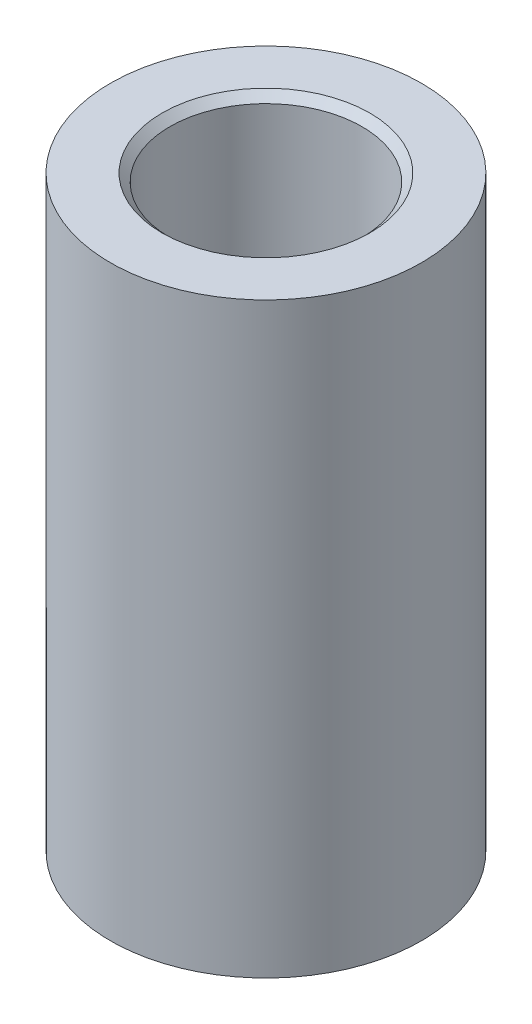
ISO-10303-21;
HEADER;
FILE_DESCRIPTION(('STEP AP214'),'2;1');
FILE_NAME('part.step','',(''),(''),'','','');
FILE_SCHEMA(('AUTOMOTIVE_DESIGN { 1 0 10303 214 1 1 1 1 }'));
ENDSEC;
DATA;
#1=APPLICATION_CONTEXT('core data for automotive mechanical design processes');
#2=APPLICATION_PROTOCOL_DEFINITION('international standard','automotive_design',2000,#1);
#3=PRODUCT_CONTEXT('',#1,'mechanical');
#4=PRODUCT('Part','Part','',(#3));
#5=PRODUCT_RELATED_PRODUCT_CATEGORY('part','',(#4));
#6=PRODUCT_DEFINITION_FORMATION('','',#4);
#7=PRODUCT_DEFINITION_CONTEXT('part definition',#1,'design');
#8=PRODUCT_DEFINITION('design','',#6,#7);
#9=PRODUCT_DEFINITION_SHAPE('','',#8);
#10=(LENGTH_UNIT() NAMED_UNIT(*) SI_UNIT(.MILLI.,.METRE.));
#11=(NAMED_UNIT(*) PLANE_ANGLE_UNIT() SI_UNIT($,.RADIAN.));
#12=(NAMED_UNIT(*) SI_UNIT($,.STERADIAN.) SOLID_ANGLE_UNIT());
#13=UNCERTAINTY_MEASURE_WITH_UNIT(LENGTH_MEASURE(1.E-05),#10,'distance_accuracy_value','');
#14=(GEOMETRIC_REPRESENTATION_CONTEXT(3) GLOBAL_UNCERTAINTY_ASSIGNED_CONTEXT((#13)) GLOBAL_UNIT_ASSIGNED_CONTEXT((#10,
#11,#12)) REPRESENTATION_CONTEXT('',''));
#15=CARTESIAN_POINT('',(0.,0.,0.));
#16=DIRECTION('',(0.,0.,1.));
#17=DIRECTION('',(1.,0.,0.));
#18=AXIS2_PLACEMENT_3D('',#15,#16,#17);
#19=CARTESIAN_POINT('',(0.,29.972,0.));
#20=DIRECTION('',(0.,-1.,0.));
#21=DIRECTION('',(0.,0.,-1.));
#22=AXIS2_PLACEMENT_3D('',#19,#20,#21);
#23=CYLINDRICAL_SURFACE('',#22,7.9375);
#24=CARTESIAN_POINT('',(0.,29.972,0.));
#25=DIRECTION('',(0.,1.,0.));
#26=DIRECTION('',(0.,0.,1.));
#27=AXIS2_PLACEMENT_3D('',#24,#25,#26);
#28=CIRCLE('',#27,7.9375);
#29=CARTESIAN_POINT('',(0.,29.972,-7.9375));
#30=VERTEX_POINT('',#29);
#31=EDGE_CURVE('E51',#30,#30,#28,.T.);
#32=CARTESIAN_POINT('',(0.,0.,0.));
#33=DIRECTION('',(0.,1.,0.));
#34=DIRECTION('',(0.,0.,1.));
#35=AXIS2_PLACEMENT_3D('',#32,#33,#34);
#36=CIRCLE('',#35,7.9375);
#37=CARTESIAN_POINT('',(0.,0.,-7.9375));
#38=VERTEX_POINT('',#37);
#39=EDGE_CURVE('E52',#38,#38,#36,.T.);
#40=CARTESIAN_POINT('',(0.,29.972,-7.9375));
#41=CARTESIAN_POINT('',(0.,29.6597916666667,-7.9375));
#42=CARTESIAN_POINT('',(0.,29.3475833333333,-7.9375));
#43=CARTESIAN_POINT('',(0.,28.7231666666667,-7.9375));
#44=CARTESIAN_POINT('',(0.,28.4109583333333,-7.9375));
#45=CARTESIAN_POINT('',(0.,27.7865416666667,-7.9375));
#46=CARTESIAN_POINT('',(0.,27.4743333333333,-7.9375));
#47=CARTESIAN_POINT('',(0.,26.8499166666667,-7.9375));
#48=CARTESIAN_POINT('',(0.,26.5377083333333,-7.9375));
#49=CARTESIAN_POINT('',(0.,25.9132916666667,-7.9375));
#50=CARTESIAN_POINT('',(0.,25.6010833333333,-7.9375));
#51=CARTESIAN_POINT('',(0.,24.9766666666667,-7.9375));
#52=CARTESIAN_POINT('',(0.,24.6644583333333,-7.9375));
#53=CARTESIAN_POINT('',(0.,24.0400416666667,-7.9375));
#54=CARTESIAN_POINT('',(0.,23.7278333333333,-7.9375));
#55=CARTESIAN_POINT('',(0.,23.1034166666667,-7.9375));
#56=CARTESIAN_POINT('',(0.,22.7912083333333,-7.9375));
#57=CARTESIAN_POINT('',(0.,22.1667916666667,-7.9375));
#58=CARTESIAN_POINT('',(0.,21.8545833333333,-7.9375));
#59=CARTESIAN_POINT('',(0.,21.2301666666667,-7.9375));
#60=CARTESIAN_POINT('',(0.,20.9179583333333,-7.9375));
#61=CARTESIAN_POINT('',(0.,20.2935416666667,-7.9375));
#62=CARTESIAN_POINT('',(0.,19.9813333333333,-7.9375));
#63=CARTESIAN_POINT('',(0.,19.3569166666667,-7.9375));
#64=CARTESIAN_POINT('',(0.,19.0447083333333,-7.9375));
#65=CARTESIAN_POINT('',(0.,18.4202916666667,-7.9375));
#66=CARTESIAN_POINT('',(0.,18.1080833333333,-7.9375));
#67=CARTESIAN_POINT('',(0.,17.4836666666667,-7.9375));
#68=CARTESIAN_POINT('',(0.,17.1714583333333,-7.9375));
#69=CARTESIAN_POINT('',(0.,16.5470416666667,-7.9375));
#70=CARTESIAN_POINT('',(0.,16.2348333333333,-7.9375));
#71=CARTESIAN_POINT('',(0.,15.6104166666667,-7.9375));
#72=CARTESIAN_POINT('',(0.,15.2982083333333,-7.9375));
#73=CARTESIAN_POINT('',(0.,14.6737916666667,-7.9375));
#74=CARTESIAN_POINT('',(0.,14.3615833333333,-7.9375));
#75=CARTESIAN_POINT('',(0.,13.7371666666667,-7.9375));
#76=CARTESIAN_POINT('',(0.,13.4249583333333,-7.9375));
#77=CARTESIAN_POINT('',(0.,12.8005416666667,-7.9375));
#78=CARTESIAN_POINT('',(0.,12.4883333333333,-7.9375));
#79=CARTESIAN_POINT('',(0.,11.8639166666667,-7.9375));
#80=CARTESIAN_POINT('',(0.,11.5517083333333,-7.9375));
#81=CARTESIAN_POINT('',(0.,10.9272916666667,-7.9375));
#82=CARTESIAN_POINT('',(0.,10.6150833333333,-7.9375));
#83=CARTESIAN_POINT('',(0.,9.99066666666667,-7.9375));
#84=CARTESIAN_POINT('',(0.,9.67845833333333,-7.9375));
#85=CARTESIAN_POINT('',(0.,9.05404166666667,-7.9375));
#86=CARTESIAN_POINT('',(0.,8.74183333333333,-7.9375));
#87=CARTESIAN_POINT('',(0.,8.11741666666667,-7.9375));
#88=CARTESIAN_POINT('',(0.,7.80520833333333,-7.9375));
#89=CARTESIAN_POINT('',(0.,7.18079166666667,-7.9375));
#90=CARTESIAN_POINT('',(0.,6.86858333333333,-7.9375));
#91=CARTESIAN_POINT('',(0.,6.24416666666667,-7.9375));
#92=CARTESIAN_POINT('',(0.,5.93195833333333,-7.9375));
#93=CARTESIAN_POINT('',(0.,5.30754166666667,-7.9375));
#94=CARTESIAN_POINT('',(0.,4.99533333333333,-7.9375));
#95=CARTESIAN_POINT('',(0.,4.37091666666667,-7.9375));
#96=CARTESIAN_POINT('',(0.,4.05870833333333,-7.9375));
#97=CARTESIAN_POINT('',(0.,3.43429166666667,-7.9375));
#98=CARTESIAN_POINT('',(0.,3.12208333333333,-7.9375));
#99=CARTESIAN_POINT('',(0.,2.49766666666667,-7.9375));
#100=CARTESIAN_POINT('',(0.,2.18545833333333,-7.9375));
#101=CARTESIAN_POINT('',(0.,1.56104166666667,-7.9375));
#102=CARTESIAN_POINT('',(0.,1.24883333333333,-7.9375));
#103=CARTESIAN_POINT('',(0.,0.624416666666667,-7.9375));
#104=CARTESIAN_POINT('',(0.,0.312208333333333,-7.9375));
#105=CARTESIAN_POINT('',(0.,0.,-7.9375));
#106=B_SPLINE_CURVE_WITH_KNOTS('',3,(#40,#41,#42,#43,#44,#45,#46,#47,#48,#49,#50,#51,#52,#53,
#54,#55,#56,#57,#58,#59,#60,#61,#62,#63,#64,#65,#66,#67,#68,#69,#70,#71,#72,#73,#74,#75,#76,#77,
#78,#79,#80,#81,#82,#83,#84,#85,#86,#87,#88,#89,#90,#91,#92,#93,#94,#95,#96,#97,#98,#99,#100,
#101,#102,#103,#104,#105),.UNSPECIFIED.,.F.,.F.,(4,2,2,2,2,2,2,2,2,2,2,2,2,2,2,2,2,2,2,2,2,2,2,
2,2,2,2,2,2,2,2,2,4),(0.,0.936624999999996,1.87325,2.809875,3.7465,4.683125,5.61975,6.556375,
7.493,8.429625,9.36625,10.302875,11.2395,12.176125,13.11275,14.049375,14.986,15.922625,16.85925,
17.795875,18.7325,19.669125,20.60575,21.542375,22.479,23.415625,24.35225,25.288875,26.2255,
27.162125,28.09875,29.035375,29.972),.UNSPECIFIED.);
#107=EDGE_CURVE('BSEAM31',#30,#38,#106,.T.);
#108=ORIENTED_EDGE('',*,*,#31,.F.);
#109=ORIENTED_EDGE('',*,*,#39,.T.);
#110=ORIENTED_EDGE('',*,*,#107,.T.);
#111=ORIENTED_EDGE('',*,*,#107,.F.);
#112=EDGE_LOOP('',(#108,#110,#109,#111));
#113=FACE_BOUND('',#112,.T.);
#114=ADVANCED_FACE('F31',(#113),#23,.T.);
#115=CARTESIAN_POINT('',(0.,29.972,0.));
#116=DIRECTION('',(0.,1.,0.));
#117=DIRECTION('',(0.,0.,1.));
#118=AXIS2_PLACEMENT_3D('',#115,#116,#117);
#119=PLANE('',#118);
#120=CARTESIAN_POINT('',(0.,29.972,0.));
#121=DIRECTION('',(0.,1.,0.));
#122=DIRECTION('',(0.,0.,1.));
#123=AXIS2_PLACEMENT_3D('',#120,#121,#122);
#124=CIRCLE('',#123,5.30219999999999);
#125=CARTESIAN_POINT('',(0.,29.972,5.30219999999999));
#126=VERTEX_POINT('',#125);
#127=EDGE_CURVE('E10',#126,#126,#124,.F.);
#128=ORIENTED_EDGE('',*,*,#127,.T.);
#129=EDGE_LOOP('',(#128));
#130=FACE_BOUND('',#129,.T.);
#131=ORIENTED_EDGE('',*,*,#31,.T.);
#132=EDGE_LOOP('',(#131));
#133=FACE_BOUND('',#132,.T.);
#134=ADVANCED_FACE('F58',(#130,#133),#119,.T.);
#135=CARTESIAN_POINT('',(0.,0.,0.));
#136=DIRECTION('',(0.,1.,0.));
#137=DIRECTION('',(0.,0.,1.));
#138=AXIS2_PLACEMENT_3D('',#135,#136,#137);
#139=PLANE('',#138);
#140=CARTESIAN_POINT('',(0.,0.,0.));
#141=DIRECTION('',(0.,1.,0.));
#142=DIRECTION('',(0.,0.,1.));
#143=AXIS2_PLACEMENT_3D('',#140,#141,#142);
#144=CIRCLE('',#143,5.30219999999999);
#145=CARTESIAN_POINT('',(0.,0.,5.30219999999999));
#146=VERTEX_POINT('',#145);
#147=EDGE_CURVE('E46',#146,#146,#144,.T.);
#148=ORIENTED_EDGE('',*,*,#147,.T.);
#149=EDGE_LOOP('',(#148));
#150=FACE_BOUND('',#149,.T.);
#151=ORIENTED_EDGE('',*,*,#39,.F.);
#152=EDGE_LOOP('',(#151));
#153=FACE_BOUND('',#152,.T.);
#154=ADVANCED_FACE('F65',(#150,#153),#139,.F.);
#155=CARTESIAN_POINT('',(0.,29.972,0.));
#156=DIRECTION('',(0.,1.,0.));
#157=DIRECTION('',(0.,0.,1.));
#158=AXIS2_PLACEMENT_3D('',#155,#156,#157);
#159=CYLINDRICAL_SURFACE('',#158,4.90219999999999);
#160=CARTESIAN_POINT('',(0.,0.400000000000001,0.));
#161=DIRECTION('',(0.,1.,0.));
#162=DIRECTION('',(0.,0.,1.));
#163=AXIS2_PLACEMENT_3D('',#160,#161,#162);
#164=CIRCLE('',#163,4.90219999999999);
#165=CARTESIAN_POINT('',(0.,0.400000000000001,4.90219999999999));
#166=VERTEX_POINT('',#165);
#167=EDGE_CURVE('E38',#166,#166,#164,.F.);
#168=ORIENTED_EDGE('',*,*,#167,.T.);
#169=EDGE_LOOP('',(#168));
#170=FACE_BOUND('',#169,.T.);
#171=CARTESIAN_POINT('',(0.,29.572,0.));
#172=DIRECTION('',(0.,1.,0.));
#173=DIRECTION('',(0.,0.,1.));
#174=AXIS2_PLACEMENT_3D('',#171,#172,#173);
#175=CIRCLE('',#174,4.90219999999999);
#176=CARTESIAN_POINT('',(0.,29.572,4.90219999999999));
#177=VERTEX_POINT('',#176);
#178=EDGE_CURVE('E42',#177,#177,#175,.T.);
#179=ORIENTED_EDGE('',*,*,#178,.T.);
#180=EDGE_LOOP('',(#179));
#181=FACE_BOUND('',#180,.T.);
#182=ADVANCED_FACE('F67',(#170,#181),#159,.F.);
#183=CARTESIAN_POINT('',(0.,0.,0.));
#184=DIRECTION('',(0.,-1.,0.));
#185=DIRECTION('',(0.,0.,-1.));
#186=AXIS2_PLACEMENT_3D('',#183,#184,#185);
#187=CONICAL_SURFACE('',#186,5.30219999999999,0.785398163397446);
#188=ORIENTED_EDGE('',*,*,#167,.F.);
#189=EDGE_LOOP('',(#188));
#190=FACE_BOUND('',#189,.T.);
#191=ORIENTED_EDGE('',*,*,#147,.F.);
#192=EDGE_LOOP('',(#191));
#193=FACE_BOUND('',#192,.T.);
#194=ADVANCED_FACE('F74',(#190,#193),#187,.F.);
#195=CARTESIAN_POINT('',(0.,29.572,0.));
#196=DIRECTION('',(0.,1.,0.));
#197=DIRECTION('',(0.,0.,1.));
#198=AXIS2_PLACEMENT_3D('',#195,#196,#197);
#199=CONICAL_SURFACE('',#198,4.90219999999999,0.785398163397446);
#200=ORIENTED_EDGE('',*,*,#127,.F.);
#201=EDGE_LOOP('',(#200));
#202=FACE_BOUND('',#201,.T.);
#203=ORIENTED_EDGE('',*,*,#178,.F.);
#204=EDGE_LOOP('',(#203));
#205=FACE_BOUND('',#204,.T.);
#206=ADVANCED_FACE('F33',(#202,#205),#199,.F.);
#207=CLOSED_SHELL('',(#114,#134,#154,#182,#194,#206));
#208=MANIFOLD_SOLID_BREP('B2',#207);
#209=ADVANCED_BREP_SHAPE_REPRESENTATION('',(#18,#208),#14);
#210=SHAPE_DEFINITION_REPRESENTATION(#9,#209);
ENDSEC;
END-ISO-10303-21;
